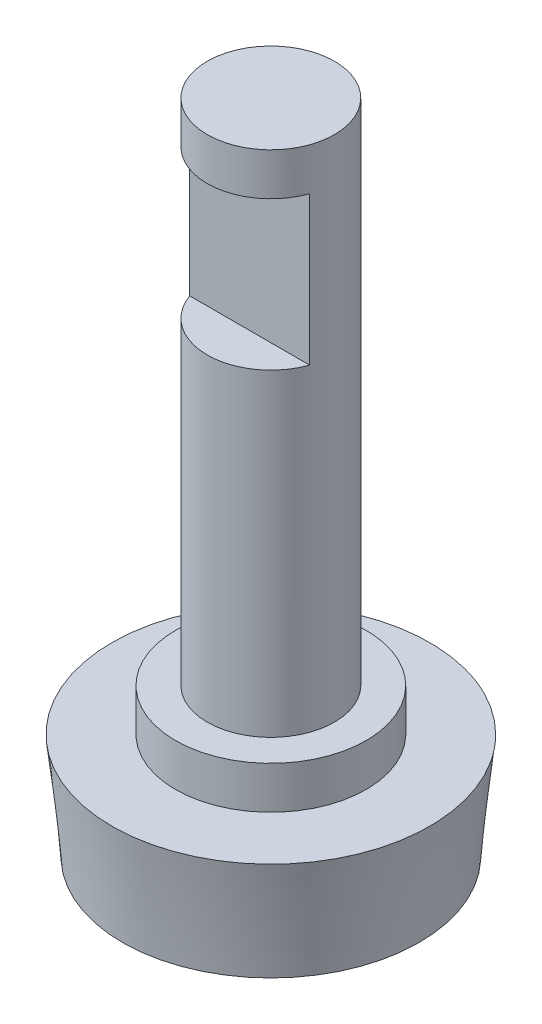
ISO-10303-21;
HEADER;
FILE_DESCRIPTION(('STEP AP214'),'2;1');
FILE_NAME('part.step','',(''),(''),'','','');
FILE_SCHEMA(('AUTOMOTIVE_DESIGN { 1 0 10303 214 1 1 1 1 }'));
ENDSEC;
DATA;
#1=APPLICATION_CONTEXT('core data for automotive mechanical design processes');
#2=APPLICATION_PROTOCOL_DEFINITION('international standard','automotive_design',2000,#1);
#3=PRODUCT_CONTEXT('',#1,'mechanical');
#4=PRODUCT('Part','Part','',(#3));
#5=PRODUCT_RELATED_PRODUCT_CATEGORY('part','',(#4));
#6=PRODUCT_DEFINITION_FORMATION('','',#4);
#7=PRODUCT_DEFINITION_CONTEXT('part definition',#1,'design');
#8=PRODUCT_DEFINITION('design','',#6,#7);
#9=PRODUCT_DEFINITION_SHAPE('','',#8);
#10=(LENGTH_UNIT() NAMED_UNIT(*) SI_UNIT(.MILLI.,.METRE.));
#11=(NAMED_UNIT(*) PLANE_ANGLE_UNIT() SI_UNIT($,.RADIAN.));
#12=(NAMED_UNIT(*) SI_UNIT($,.STERADIAN.) SOLID_ANGLE_UNIT());
#13=UNCERTAINTY_MEASURE_WITH_UNIT(LENGTH_MEASURE(1.E-05),#10,'distance_accuracy_value','');
#14=(GEOMETRIC_REPRESENTATION_CONTEXT(3) GLOBAL_UNCERTAINTY_ASSIGNED_CONTEXT((#13)) GLOBAL_UNIT_ASSIGNED_CONTEXT((#10,
#11,#12)) REPRESENTATION_CONTEXT('',''));
#15=CARTESIAN_POINT('',(0.,0.,0.));
#16=DIRECTION('',(0.,0.,1.));
#17=DIRECTION('',(1.,0.,0.));
#18=AXIS2_PLACEMENT_3D('',#15,#16,#17);
#19=CARTESIAN_POINT('',(0.,15.5,0.));
#20=DIRECTION('',(0.,-1.,0.));
#21=DIRECTION('',(0.,0.,-1.));
#22=AXIS2_PLACEMENT_3D('',#19,#20,#21);
#23=CYLINDRICAL_SURFACE('',#22,1.5);
#24=CARTESIAN_POINT('',(0.,3.5,0.));
#25=DIRECTION('',(0.,1.,0.));
#26=DIRECTION('',(0.,0.,1.));
#27=AXIS2_PLACEMENT_3D('',#24,#25,#26);
#28=CIRCLE('',#27,1.5);
#29=CARTESIAN_POINT('',(0.,3.5,1.5));
#30=VERTEX_POINT('',#29);
#31=EDGE_CURVE('E12',#30,#30,#28,.T.);
#32=ORIENTED_EDGE('',*,*,#31,.T.);
#33=EDGE_LOOP('',(#32));
#34=FACE_BOUND('',#33,.T.);
#35=CARTESIAN_POINT('',(0.,15.5,0.));
#36=DIRECTION('',(0.,1.,0.));
#37=DIRECTION('',(0.,0.,1.));
#38=AXIS2_PLACEMENT_3D('',#35,#36,#37);
#39=CIRCLE('',#38,1.5);
#40=CARTESIAN_POINT('',(0.,15.5,1.5));
#41=VERTEX_POINT('',#40);
#42=EDGE_CURVE('E89',#41,#41,#39,.T.);
#43=ORIENTED_EDGE('',*,*,#42,.F.);
#44=EDGE_LOOP('',(#43));
#45=FACE_BOUND('',#44,.T.);
#46=CARTESIAN_POINT('',(0.,11.,0.));
#47=DIRECTION('',(0.,1.,0.));
#48=DIRECTION('',(0.,0.,1.));
#49=AXIS2_PLACEMENT_3D('',#46,#47,#48);
#50=CIRCLE('',#49,1.5);
#51=CARTESIAN_POINT('',(-1.41421356237309,11.,0.5));
#52=VERTEX_POINT('',#51);
#53=CARTESIAN_POINT('',(1.41421356237309,11.,0.5));
#54=VERTEX_POINT('',#53);
#55=EDGE_CURVE('E86',#52,#54,#50,.T.);
#56=ORIENTED_EDGE('',*,*,#55,.F.);
#57=DIRECTION('',(0.,1.,0.));
#58=VECTOR('',#57,1.);
#59=CARTESIAN_POINT('',(-1.41421356237309,11.,0.5));
#60=LINE('',#59,#58);
#61=CARTESIAN_POINT('',(-1.41421356237309,14.5,0.5));
#62=VERTEX_POINT('',#61);
#63=EDGE_CURVE('E73',#52,#62,#60,.T.);
#64=ORIENTED_EDGE('',*,*,#63,.T.);
#65=CARTESIAN_POINT('',(0.,14.5,0.));
#66=DIRECTION('',(0.,1.,0.));
#67=DIRECTION('',(0.,0.,1.));
#68=AXIS2_PLACEMENT_3D('',#65,#66,#67);
#69=CIRCLE('',#68,1.5);
#70=CARTESIAN_POINT('',(1.41421356237309,14.5,0.5));
#71=VERTEX_POINT('',#70);
#72=EDGE_CURVE('E79',#62,#71,#69,.T.);
#73=ORIENTED_EDGE('',*,*,#72,.T.);
#74=DIRECTION('',(0.,1.,0.));
#75=VECTOR('',#74,1.);
#76=CARTESIAN_POINT('',(1.41421356237309,11.,0.5));
#77=LINE('',#76,#75);
#78=EDGE_CURVE('E85',#54,#71,#77,.T.);
#79=ORIENTED_EDGE('',*,*,#78,.F.);
#80=EDGE_LOOP('',(#56,#64,#73,#79));
#81=FACE_BOUND('',#80,.T.);
#82=ADVANCED_FACE('F48',(#34,#45,#81),#23,.T.);
#83=CARTESIAN_POINT('',(0.,2.5,0.));
#84=DIRECTION('',(0.,1.,0.));
#85=DIRECTION('',(0.,0.,1.));
#86=AXIS2_PLACEMENT_3D('',#83,#84,#85);
#87=PLANE('',#86);
#88=CARTESIAN_POINT('',(0.,2.5,0.));
#89=DIRECTION('',(0.,1.,0.));
#90=DIRECTION('',(0.,0.,1.));
#91=AXIS2_PLACEMENT_3D('',#88,#89,#90);
#92=CIRCLE('',#91,2.25);
#93=CARTESIAN_POINT('',(0.,2.5,2.25));
#94=VERTEX_POINT('',#93);
#95=EDGE_CURVE('E58',#94,#94,#92,.T.);
#96=ORIENTED_EDGE('',*,*,#95,.F.);
#97=EDGE_LOOP('',(#96));
#98=FACE_BOUND('',#97,.T.);
#99=CARTESIAN_POINT('',(0.,2.5,0.));
#100=DIRECTION('',(0.,1.,0.));
#101=DIRECTION('',(0.,0.,1.));
#102=AXIS2_PLACEMENT_3D('',#99,#100,#101);
#103=CIRCLE('',#102,3.75);
#104=CARTESIAN_POINT('',(-2.1927418516376,2.5,3.04210176885602));
#105=VERTEX_POINT('',#104);
#106=EDGE_CURVE('E102',#105,#105,#103,.T.);
#107=ORIENTED_EDGE('',*,*,#106,.T.);
#108=EDGE_LOOP('',(#107));
#109=FACE_BOUND('',#108,.T.);
#110=ADVANCED_FACE('F50',(#98,#109),#87,.T.);
#111=CARTESIAN_POINT('',(0.,0.,0.));
#112=DIRECTION('',(0.,1.,0.));
#113=DIRECTION('',(0.,0.,1.));
#114=AXIS2_PLACEMENT_3D('',#111,#112,#113);
#115=PLANE('',#114);
#116=CARTESIAN_POINT('',(0.,0.,0.));
#117=DIRECTION('',(0.,1.,0.));
#118=DIRECTION('',(0.,0.,1.));
#119=AXIS2_PLACEMENT_3D('',#116,#117,#118);
#120=CIRCLE('',#119,3.5);
#121=CARTESIAN_POINT('',(-1.4503145334765,0.,3.18537089739748));
#122=VERTEX_POINT('',#121);
#123=EDGE_CURVE('E99',#122,#122,#120,.T.);
#124=ORIENTED_EDGE('',*,*,#123,.F.);
#125=EDGE_LOOP('',(#124));
#126=FACE_BOUND('',#125,.T.);
#127=ADVANCED_FACE('F124',(#126),#115,.F.);
#128=CARTESIAN_POINT('',(-1.4503145334765,0.,3.18537089739748));
#129=CARTESIAN_POINT('',(-2.1927418516376,2.5,3.04210176885602));
#130=CARTESIAN_POINT('',(4.92042726131847,0.,6.08599996435048));
#131=CARTESIAN_POINT('',(3.89146168607443,2.5,7.42758547213122));
#132=CARTESIAN_POINT('',(7.82105632827146,0.,-0.284741830444495));
#133=CARTESIAN_POINT('',(8.27694538934963,2.5,1.34338193441919));
#134=CARTESIAN_POINT('',(1.4503145334765,0.,-3.18537089739748));
#135=CARTESIAN_POINT('',(2.1927418516376,2.5,-3.04210176885602));
#136=CARTESIAN_POINT('',(-4.92042726131847,0.,-6.08599996435048));
#137=CARTESIAN_POINT('',(-3.89146168607443,2.5,-7.42758547213122));
#138=CARTESIAN_POINT('',(-7.82105632827146,0.,0.284741830444494));
#139=CARTESIAN_POINT('',(-8.27694538934963,2.5,-1.34338193441919));
#140=CARTESIAN_POINT('',(-1.4503145334765,0.,3.18537089739748));
#141=CARTESIAN_POINT('',(-2.1927418516376,2.5,3.04210176885602));
#142=(BOUNDED_SURFACE() B_SPLINE_SURFACE(3,1,((#128,#129),(#130,#131),(#132,#133),(#134,#135),
(#136,#137),(#138,#139),(#140,#141)),.UNSPECIFIED.,.T.,.F.,.F.) B_SPLINE_SURFACE_WITH_KNOTS((4,
3,4),(2,2),(0.,0.5,1.),(0.,1.),
.UNSPECIFIED.) GEOMETRIC_REPRESENTATION_ITEM() RATIONAL_B_SPLINE_SURFACE(((1.,1.),
(0.333333333333333,0.333333333333333),(0.333333333333333,0.333333333333333),(1.,1.),
(0.333333333333333,0.333333333333333),(0.333333333333333,0.333333333333333),(1.,1.))) REPRESENTATION_ITEM('') SURFACE());
#143=CARTESIAN_POINT('',(-1.4503145334765,0.,3.18537089739748));
#144=CARTESIAN_POINT('',(-1.45804815137401,0.0260416666666666,3.18387851064184));
#145=CARTESIAN_POINT('',(-1.46578176927152,0.0520833333333333,3.1823861238862));
#146=CARTESIAN_POINT('',(-1.48124900506654,0.104166666666667,3.17940135037492));
#147=CARTESIAN_POINT('',(-1.48898262296405,0.130208333333333,3.17790896361928));
#148=CARTESIAN_POINT('',(-1.50444985875908,0.182291666666667,3.174924190108));
#149=CARTESIAN_POINT('',(-1.51218347665659,0.208333333333333,3.17343180335236));
#150=CARTESIAN_POINT('',(-1.52765071245161,0.260416666666667,3.17044702984108));
#151=CARTESIAN_POINT('',(-1.53538433034912,0.286458333333333,3.16895464308544));
#152=CARTESIAN_POINT('',(-1.55085156614415,0.338541666666667,3.16596986957416));
#153=CARTESIAN_POINT('',(-1.55858518404166,0.364583333333333,3.16447748281852));
#154=CARTESIAN_POINT('',(-1.57405241983668,0.416666666666667,3.16149270930724));
#155=CARTESIAN_POINT('',(-1.58178603773419,0.442708333333333,3.1600003225516));
#156=CARTESIAN_POINT('',(-1.59725327352921,0.494791666666667,3.15701554904032));
#157=CARTESIAN_POINT('',(-1.60498689142673,0.520833333333333,3.15552316228468));
#158=CARTESIAN_POINT('',(-1.62045412722175,0.572916666666667,3.1525383887734));
#159=CARTESIAN_POINT('',(-1.62818774511926,0.598958333333333,3.15104600201776));
#160=CARTESIAN_POINT('',(-1.64365498091428,0.651041666666667,3.14806122850648));
#161=CARTESIAN_POINT('',(-1.6513885988118,0.677083333333333,3.14656884175084));
#162=CARTESIAN_POINT('',(-1.66685583460682,0.729166666666667,3.14358406823956));
#163=CARTESIAN_POINT('',(-1.67458945250433,0.755208333333333,3.14209168148392));
#164=CARTESIAN_POINT('',(-1.69005668829935,0.807291666666667,3.13910690797263));
#165=CARTESIAN_POINT('',(-1.69779030619686,0.833333333333333,3.137614521217));
#166=CARTESIAN_POINT('',(-1.71325754199189,0.885416666666667,3.13462974770571));
#167=CARTESIAN_POINT('',(-1.7209911598894,0.911458333333333,3.13313736095007));
#168=CARTESIAN_POINT('',(-1.73645839568442,0.963541666666667,3.13015258743879));
#169=CARTESIAN_POINT('',(-1.74419201358193,0.989583333333333,3.12866020068315));
#170=CARTESIAN_POINT('',(-1.75965924937696,1.04166666666667,3.12567542717187));
#171=CARTESIAN_POINT('',(-1.76739286727447,1.06770833333333,3.12418304041623));
#172=CARTESIAN_POINT('',(-1.78286010306949,1.11979166666667,3.12119826690495));
#173=CARTESIAN_POINT('',(-1.790593720967,1.14583333333333,3.11970588014931));
#174=CARTESIAN_POINT('',(-1.80606095676203,1.19791666666667,3.11672110663803));
#175=CARTESIAN_POINT('',(-1.81379457465954,1.22395833333333,3.11522871988239));
#176=CARTESIAN_POINT('',(-1.82926181045456,1.27604166666667,3.11224394637111));
#177=CARTESIAN_POINT('',(-1.83699542835207,1.30208333333333,3.11075155961547));
#178=CARTESIAN_POINT('',(-1.8524626641471,1.35416666666667,3.10776678610419));
#179=CARTESIAN_POINT('',(-1.86019628204461,1.38020833333333,3.10627439934855));
#180=CARTESIAN_POINT('',(-1.87566351783963,1.43229166666667,3.10328962583727));
#181=CARTESIAN_POINT('',(-1.88339713573714,1.45833333333333,3.10179723908163));
#182=CARTESIAN_POINT('',(-1.89886437153216,1.51041666666667,3.09881246557035));
#183=CARTESIAN_POINT('',(-1.90659798942968,1.53645833333333,3.09732007881471));
#184=CARTESIAN_POINT('',(-1.9220652252247,1.58854166666667,3.09433530530343));
#185=CARTESIAN_POINT('',(-1.92979884312221,1.61458333333333,3.09284291854779));
#186=CARTESIAN_POINT('',(-1.94526607891723,1.66666666666667,3.08985814503651));
#187=CARTESIAN_POINT('',(-1.95299969681474,1.69270833333333,3.08836575828086));
#188=CARTESIAN_POINT('',(-1.96846693260977,1.74479166666667,3.08538098476958));
#189=CARTESIAN_POINT('',(-1.97620055050728,1.77083333333333,3.08388859801394));
#190=CARTESIAN_POINT('',(-1.9916677863023,1.82291666666667,3.08090382450266));
#191=CARTESIAN_POINT('',(-1.99940140419981,1.84895833333333,3.07941143774702));
#192=CARTESIAN_POINT('',(-2.01486863999484,1.90104166666667,3.07642666423574));
#193=CARTESIAN_POINT('',(-2.02260225789235,1.92708333333333,3.0749342774801));
#194=CARTESIAN_POINT('',(-2.03806949368737,1.97916666666667,3.07194950396882));
#195=CARTESIAN_POINT('',(-2.04580311158488,2.00520833333333,3.07045711721318));
#196=CARTESIAN_POINT('',(-2.06127034737991,2.05729166666667,3.0674723437019));
#197=CARTESIAN_POINT('',(-2.06900396527742,2.08333333333333,3.06597995694626));
#198=CARTESIAN_POINT('',(-2.08447120107244,2.13541666666667,3.06299518343498));
#199=CARTESIAN_POINT('',(-2.09220481896995,2.16145833333333,3.06150279667934));
#200=CARTESIAN_POINT('',(-2.10767205476498,2.21354166666667,3.05851802316806));
#201=CARTESIAN_POINT('',(-2.11540567266249,2.23958333333333,3.05702563641242));
#202=CARTESIAN_POINT('',(-2.13087290845751,2.29166666666667,3.05404086290114));
#203=CARTESIAN_POINT('',(-2.13860652635502,2.31770833333333,3.0525484761455));
#204=CARTESIAN_POINT('',(-2.15407376215004,2.36979166666667,3.04956370263422));
#205=CARTESIAN_POINT('',(-2.16180738004756,2.39583333333333,3.04807131587858));
#206=CARTESIAN_POINT('',(-2.17727461584258,2.44791666666667,3.0450865423673));
#207=CARTESIAN_POINT('',(-2.18500823374009,2.47395833333333,3.04359415561166));
#208=CARTESIAN_POINT('',(-2.1927418516376,2.5,3.04210176885602));
#209=B_SPLINE_CURVE_WITH_KNOTS('',3,(#143,#144,#145,#146,#147,#148,#149,#150,#151,#152,#153,
#154,#155,#156,#157,#158,#159,#160,#161,#162,#163,#164,#165,#166,#167,#168,#169,#170,#171,#172,
#173,#174,#175,#176,#177,#178,#179,#180,#181,#182,#183,#184,#185,#186,#187,#188,#189,#190,#191,
#192,#193,#194,#195,#196,#197,#198,#199,#200,#201,#202,#203,#204,#205,#206,#207,#208),
.UNSPECIFIED.,.F.,.F.,(4,2,2,2,2,2,2,2,2,2,2,2,2,2,2,2,2,2,2,2,2,2,2,2,2,2,2,2,2,2,2,2,4),(0.,
0.0816200967967945,0.163240193593589,0.244860290390383,0.326480387187178,0.408100483983972,
0.489720580780767,0.571340677577561,0.652960774374355,0.73458087117115,0.816200967967944,
0.897821064764739,0.979441161561533,1.06106125835833,1.14268135515512,1.22430145195192,
1.30592154874871,1.38754164554551,1.4691617423423,1.55078183913909,1.63240193593589,
1.71402203273268,1.79564212952948,1.87726222632627,1.95888232312307,2.04050241991986,
2.12212251671666,2.20374261351345,2.28536271031024,2.36698280710704,2.44860290390383,
2.53022300070063,2.61184309749742),.UNSPECIFIED.);
#210=EDGE_CURVE('BSEAM112',#122,#105,#209,.T.);
#211=ORIENTED_EDGE('',*,*,#123,.T.);
#212=ORIENTED_EDGE('',*,*,#106,.F.);
#213=ORIENTED_EDGE('',*,*,#210,.T.);
#214=ORIENTED_EDGE('',*,*,#210,.F.);
#215=EDGE_LOOP('',(#211,#213,#212,#214));
#216=FACE_BOUND('',#215,.T.);
#217=ADVANCED_FACE('F112',(#216),#142,.T.);
#218=CARTESIAN_POINT('',(0.,3.5,0.));
#219=DIRECTION('',(0.,-1.,0.));
#220=DIRECTION('',(0.,0.,-1.));
#221=AXIS2_PLACEMENT_3D('',#218,#219,#220);
#222=CYLINDRICAL_SURFACE('',#221,2.25);
#223=CARTESIAN_POINT('',(0.,3.5,0.));
#224=DIRECTION('',(0.,1.,0.));
#225=DIRECTION('',(0.,0.,1.));
#226=AXIS2_PLACEMENT_3D('',#223,#224,#225);
#227=CIRCLE('',#226,2.25);
#228=CARTESIAN_POINT('',(0.,3.5,2.25));
#229=VERTEX_POINT('',#228);
#230=EDGE_CURVE('E92',#229,#229,#227,.T.);
#231=ORIENTED_EDGE('',*,*,#230,.F.);
#232=EDGE_LOOP('',(#231));
#233=FACE_BOUND('',#232,.T.);
#234=ORIENTED_EDGE('',*,*,#95,.T.);
#235=EDGE_LOOP('',(#234));
#236=FACE_BOUND('',#235,.T.);
#237=ADVANCED_FACE('F123',(#233,#236),#222,.T.);
#238=CARTESIAN_POINT('',(0.,3.5,0.));
#239=DIRECTION('',(0.,1.,0.));
#240=DIRECTION('',(0.,0.,1.));
#241=AXIS2_PLACEMENT_3D('',#238,#239,#240);
#242=PLANE('',#241);
#243=ORIENTED_EDGE('',*,*,#31,.F.);
#244=EDGE_LOOP('',(#243));
#245=FACE_BOUND('',#244,.T.);
#246=ORIENTED_EDGE('',*,*,#230,.T.);
#247=EDGE_LOOP('',(#246));
#248=FACE_BOUND('',#247,.T.);
#249=ADVANCED_FACE('F176',(#245,#248),#242,.T.);
#250=CARTESIAN_POINT('',(0.,15.5,0.));
#251=DIRECTION('',(0.,1.,0.));
#252=DIRECTION('',(0.,0.,1.));
#253=AXIS2_PLACEMENT_3D('',#250,#251,#252);
#254=PLANE('',#253);
#255=ORIENTED_EDGE('',*,*,#42,.T.);
#256=EDGE_LOOP('',(#255));
#257=FACE_BOUND('',#256,.T.);
#258=ADVANCED_FACE('F181',(#257),#254,.T.);
#259=CARTESIAN_POINT('',(-1.41421356237309,11.,0.5));
#260=DIRECTION('',(0.,0.,-1.));
#261=DIRECTION('',(-1.,0.,0.));
#262=AXIS2_PLACEMENT_3D('',#259,#260,#261);
#263=PLANE('',#262);
#264=DIRECTION('',(-1.,0.,0.));
#265=VECTOR('',#264,1.);
#266=CARTESIAN_POINT('',(-1.41421356237309,14.5,0.5));
#267=LINE('',#266,#265);
#268=EDGE_CURVE('E65',#71,#62,#267,.T.);
#269=ORIENTED_EDGE('',*,*,#268,.T.);
#270=ORIENTED_EDGE('',*,*,#63,.F.);
#271=DIRECTION('',(-1.,0.,0.));
#272=VECTOR('',#271,1.);
#273=CARTESIAN_POINT('',(-1.41421356237309,11.,0.5));
#274=LINE('',#273,#272);
#275=EDGE_CURVE('E94',#54,#52,#274,.T.);
#276=ORIENTED_EDGE('',*,*,#275,.F.);
#277=ORIENTED_EDGE('',*,*,#78,.T.);
#278=EDGE_LOOP('',(#269,#270,#276,#277));
#279=FACE_BOUND('',#278,.T.);
#280=ADVANCED_FACE('F84',(#279),#263,.F.);
#281=CARTESIAN_POINT('',(0.,11.,0.));
#282=DIRECTION('',(0.,1.,0.));
#283=DIRECTION('',(0.,0.,1.));
#284=AXIS2_PLACEMENT_3D('',#281,#282,#283);
#285=PLANE('',#284);
#286=ORIENTED_EDGE('',*,*,#55,.T.);
#287=ORIENTED_EDGE('',*,*,#275,.T.);
#288=EDGE_LOOP('',(#286,#287));
#289=FACE_BOUND('',#288,.T.);
#290=ADVANCED_FACE('F191',(#289),#285,.T.);
#291=CARTESIAN_POINT('',(0.,14.5,0.));
#292=DIRECTION('',(0.,1.,0.));
#293=DIRECTION('',(0.,0.,1.));
#294=AXIS2_PLACEMENT_3D('',#291,#292,#293);
#295=PLANE('',#294);
#296=ORIENTED_EDGE('',*,*,#72,.F.);
#297=ORIENTED_EDGE('',*,*,#268,.F.);
#298=EDGE_LOOP('',(#296,#297));
#299=FACE_BOUND('',#298,.T.);
#300=ADVANCED_FACE('F80',(#299),#295,.F.);
#301=CLOSED_SHELL('',(#82,#110,#127,#217,#237,#249,#258,#280,#290,#300));
#302=MANIFOLD_SOLID_BREP('B2',#301);
#303=ADVANCED_BREP_SHAPE_REPRESENTATION('',(#18,#302),#14);
#304=SHAPE_DEFINITION_REPRESENTATION(#9,#303);
ENDSEC;
END-ISO-10303-21;
